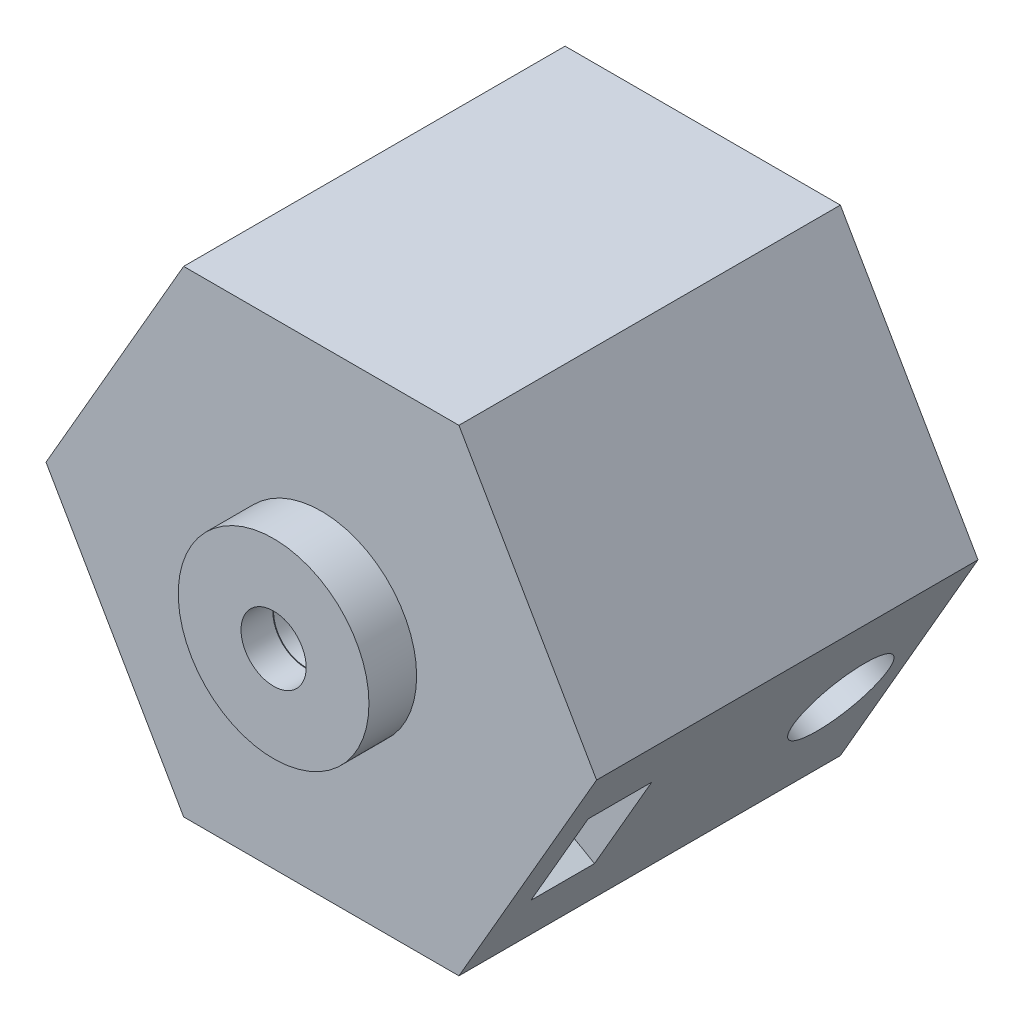
ISO-10303-21;
HEADER;
FILE_DESCRIPTION(('STEP AP214'),'2;1');
FILE_NAME('part.step','',(''),(''),'','','');
FILE_SCHEMA(('AUTOMOTIVE_DESIGN { 1 0 10303 214 1 1 1 1 }'));
ENDSEC;
DATA;
#1=APPLICATION_CONTEXT('core data for automotive mechanical design processes');
#2=APPLICATION_PROTOCOL_DEFINITION('international standard','automotive_design',2000,#1);
#3=PRODUCT_CONTEXT('',#1,'mechanical');
#4=PRODUCT('Part','Part','',(#3));
#5=PRODUCT_RELATED_PRODUCT_CATEGORY('part','',(#4));
#6=PRODUCT_DEFINITION_FORMATION('','',#4);
#7=PRODUCT_DEFINITION_CONTEXT('part definition',#1,'design');
#8=PRODUCT_DEFINITION('design','',#6,#7);
#9=PRODUCT_DEFINITION_SHAPE('','',#8);
#10=(LENGTH_UNIT() NAMED_UNIT(*) SI_UNIT(.MILLI.,.METRE.));
#11=(NAMED_UNIT(*) PLANE_ANGLE_UNIT() SI_UNIT($,.RADIAN.));
#12=(NAMED_UNIT(*) SI_UNIT($,.STERADIAN.) SOLID_ANGLE_UNIT());
#13=UNCERTAINTY_MEASURE_WITH_UNIT(LENGTH_MEASURE(1.E-05),#10,'distance_accuracy_value','');
#14=(GEOMETRIC_REPRESENTATION_CONTEXT(3) GLOBAL_UNCERTAINTY_ASSIGNED_CONTEXT((#13)) GLOBAL_UNIT_ASSIGNED_CONTEXT((#10,
#11,#12)) REPRESENTATION_CONTEXT('',''));
#15=CARTESIAN_POINT('',(0.,0.,0.));
#16=DIRECTION('',(0.,0.,1.));
#17=DIRECTION('',(1.,0.,0.));
#18=AXIS2_PLACEMENT_3D('',#15,#16,#17);
#19=CARTESIAN_POINT('',(8.66025403784438,-15.,11.));
#20=DIRECTION('',(-0.866025403784438,0.5,0.));
#21=DIRECTION('',(-0.5,-0.866025403784439,0.));
#22=AXIS2_PLACEMENT_3D('',#19,#20,#21);
#23=PLANE('',#22);
#24=DIRECTION('',(0.,0.,-1.));
#25=VECTOR('',#24,1.);
#26=CARTESIAN_POINT('',(14.7903810567666,-4.38230854637602,11.));
#27=LINE('',#26,#25);
#28=CARTESIAN_POINT('',(14.7903810567666,-4.38230854637602,22.));
#29=VERTEX_POINT('',#28);
#30=CARTESIAN_POINT('',(14.7903810567666,-4.38230854637602,18.));
#31=VERTEX_POINT('',#30);
#32=EDGE_CURVE('E409',#29,#31,#27,.T.);
#33=ORIENTED_EDGE('',*,*,#32,.T.);
#34=DIRECTION('',(-0.5,-0.866025403784439,0.));
#35=VECTOR('',#34,1.);
#36=CARTESIAN_POINT('',(8.66025403784438,-15.,18.));
#37=LINE('',#36,#35);
#38=CARTESIAN_POINT('',(11.1903810567666,-10.617691453624,18.));
#39=VERTEX_POINT('',#38);
#40=EDGE_CURVE('E412',#31,#39,#37,.T.);
#41=ORIENTED_EDGE('',*,*,#40,.T.);
#42=DIRECTION('',(0.,0.,1.));
#43=VECTOR('',#42,1.);
#44=CARTESIAN_POINT('',(11.1903810567666,-10.617691453624,11.));
#45=LINE('',#44,#43);
#46=CARTESIAN_POINT('',(11.1903810567666,-10.617691453624,22.));
#47=VERTEX_POINT('',#46);
#48=EDGE_CURVE('E389',#39,#47,#45,.T.);
#49=ORIENTED_EDGE('',*,*,#48,.T.);
#50=DIRECTION('',(0.5,0.866025403784439,0.));
#51=VECTOR('',#50,1.);
#52=CARTESIAN_POINT('',(8.66025403784438,-15.,22.));
#53=LINE('',#52,#51);
#54=EDGE_CURVE('E401',#47,#29,#53,.T.);
#55=ORIENTED_EDGE('',*,*,#54,.T.);
#56=EDGE_LOOP('',(#33,#41,#49,#55));
#57=FACE_BOUND('',#56,.T.);
#58=CARTESIAN_POINT('',(12.9903810567666,-7.5,4.3));
#59=DIRECTION('',(-0.866025403784438,0.5,0.));
#60=DIRECTION('',(-0.5,-0.866025403784439,0.));
#61=AXIS2_PLACEMENT_3D('',#58,#59,#60);
#62=CIRCLE('',#61,3.);
#63=CARTESIAN_POINT('',(11.4903810567666,-10.0980762113533,4.3));
#64=VERTEX_POINT('',#63);
#65=EDGE_CURVE('E367',#64,#64,#62,.T.);
#66=ORIENTED_EDGE('',*,*,#65,.T.);
#67=EDGE_LOOP('',(#66));
#68=FACE_BOUND('',#67,.T.);
#69=DIRECTION('',(0.499999999999993,0.866025403784443,0.));
#70=VECTOR('',#69,1.);
#71=CARTESIAN_POINT('',(8.66025403784448,-14.9999999999999,24.));
#72=LINE('',#71,#70);
#73=CARTESIAN_POINT('',(8.66025403784448,-14.9999999999999,24.));
#74=VERTEX_POINT('',#73);
#75=CARTESIAN_POINT('',(17.3205080756888,1.54390389361936E-13,24.));
#76=VERTEX_POINT('',#75);
#77=EDGE_CURVE('E350',#74,#76,#72,.T.);
#78=ORIENTED_EDGE('',*,*,#77,.F.);
#79=DIRECTION('',(0.,0.,-1.));
#80=VECTOR('',#79,1.);
#81=CARTESIAN_POINT('',(8.66025403784438,-15.,11.));
#82=LINE('',#81,#80);
#83=CARTESIAN_POINT('',(8.66025403784438,-15.,0.));
#84=VERTEX_POINT('',#83);
#85=EDGE_CURVE('E330',#74,#84,#82,.T.);
#86=ORIENTED_EDGE('',*,*,#85,.T.);
#87=DIRECTION('',(0.5,0.866025403784439,0.));
#88=VECTOR('',#87,1.);
#89=CARTESIAN_POINT('',(8.66025403784438,-15.,0.));
#90=LINE('',#89,#88);
#91=CARTESIAN_POINT('',(17.3205080756888,0.,0.));
#92=VERTEX_POINT('',#91);
#93=EDGE_CURVE('E309',#84,#92,#90,.T.);
#94=ORIENTED_EDGE('',*,*,#93,.T.);
#95=DIRECTION('',(0.,0.,-1.));
#96=VECTOR('',#95,1.);
#97=CARTESIAN_POINT('',(17.3205080756888,0.,11.));
#98=LINE('',#97,#96);
#99=EDGE_CURVE('E12',#76,#92,#98,.T.);
#100=ORIENTED_EDGE('',*,*,#99,.F.);
#101=EDGE_LOOP('',(#78,#86,#94,#100));
#102=FACE_BOUND('',#101,.T.);
#103=ADVANCED_FACE('F65',(#57,#68,#102),#23,.F.);
#104=CARTESIAN_POINT('',(17.3205080756888,0.,11.));
#105=DIRECTION('',(-0.866025403784439,-0.5,0.));
#106=DIRECTION('',(0.5,-0.866025403784439,0.));
#107=AXIS2_PLACEMENT_3D('',#104,#105,#106);
#108=PLANE('',#107);
#109=DIRECTION('',(-0.500000000000009,0.866025403784434,0.));
#110=VECTOR('',#109,1.);
#111=CARTESIAN_POINT('',(17.3205080756888,1.54390389361936E-13,24.));
#112=LINE('',#111,#110);
#113=CARTESIAN_POINT('',(8.66025403784422,15.0000000000001,24.));
#114=VERTEX_POINT('',#113);
#115=EDGE_CURVE('E182',#76,#114,#112,.T.);
#116=ORIENTED_EDGE('',*,*,#115,.F.);
#117=ORIENTED_EDGE('',*,*,#99,.T.);
#118=DIRECTION('',(-0.5,0.866025403784439,0.));
#119=VECTOR('',#118,1.);
#120=CARTESIAN_POINT('',(17.3205080756888,0.,0.));
#121=LINE('',#120,#119);
#122=CARTESIAN_POINT('',(8.66025403784438,15.,0.));
#123=VERTEX_POINT('',#122);
#124=EDGE_CURVE('E313',#92,#123,#121,.T.);
#125=ORIENTED_EDGE('',*,*,#124,.T.);
#126=DIRECTION('',(0.,0.,-1.));
#127=VECTOR('',#126,1.);
#128=CARTESIAN_POINT('',(8.66025403784438,15.,11.));
#129=LINE('',#128,#127);
#130=EDGE_CURVE('E74',#114,#123,#129,.T.);
#131=ORIENTED_EDGE('',*,*,#130,.F.);
#132=EDGE_LOOP('',(#116,#117,#125,#131));
#133=FACE_BOUND('',#132,.T.);
#134=ADVANCED_FACE('F438',(#133),#108,.F.);
#135=CARTESIAN_POINT('',(8.66025403784438,15.,11.));
#136=DIRECTION('',(0.,-1.,0.));
#137=DIRECTION('',(1.,0.,0.));
#138=AXIS2_PLACEMENT_3D('',#135,#136,#137);
#139=PLANE('',#138);
#140=DIRECTION('',(-1.,0.,0.));
#141=VECTOR('',#140,1.);
#142=CARTESIAN_POINT('',(8.66025403784422,15.0000000000001,24.));
#143=LINE('',#142,#141);
#144=CARTESIAN_POINT('',(-8.66025403784438,15.,24.));
#145=VERTEX_POINT('',#144);
#146=EDGE_CURVE('E177',#114,#145,#143,.T.);
#147=ORIENTED_EDGE('',*,*,#146,.F.);
#148=ORIENTED_EDGE('',*,*,#130,.T.);
#149=DIRECTION('',(-1.,0.,0.));
#150=VECTOR('',#149,1.);
#151=CARTESIAN_POINT('',(8.66025403784438,15.,0.));
#152=LINE('',#151,#150);
#153=CARTESIAN_POINT('',(-8.66025403784438,15.,0.));
#154=VERTEX_POINT('',#153);
#155=EDGE_CURVE('E200',#123,#154,#152,.T.);
#156=ORIENTED_EDGE('',*,*,#155,.T.);
#157=DIRECTION('',(0.,0.,-1.));
#158=VECTOR('',#157,1.);
#159=CARTESIAN_POINT('',(-8.66025403784438,15.,11.));
#160=LINE('',#159,#158);
#161=EDGE_CURVE('E193',#145,#154,#160,.T.);
#162=ORIENTED_EDGE('',*,*,#161,.F.);
#163=EDGE_LOOP('',(#147,#148,#156,#162));
#164=FACE_BOUND('',#163,.T.);
#165=ADVANCED_FACE('F198',(#164),#139,.F.);
#166=CARTESIAN_POINT('',(-8.66025403784438,15.,11.));
#167=DIRECTION('',(0.866025403784439,-0.5,0.));
#168=DIRECTION('',(0.5,0.866025403784439,0.));
#169=AXIS2_PLACEMENT_3D('',#166,#167,#168);
#170=PLANE('',#169);
#171=DIRECTION('',(0.,0.,1.));
#172=VECTOR('',#171,1.);
#173=CARTESIAN_POINT('',(-14.7903810567666,4.38230854637602,18.));
#174=LINE('',#173,#172);
#175=CARTESIAN_POINT('',(-14.7903810567666,4.38230854637602,18.));
#176=VERTEX_POINT('',#175);
#177=CARTESIAN_POINT('',(-14.7903810567666,4.38230854637602,22.));
#178=VERTEX_POINT('',#177);
#179=EDGE_CURVE('E374',#176,#178,#174,.T.);
#180=ORIENTED_EDGE('',*,*,#179,.F.);
#181=DIRECTION('',(-0.5,-0.866025403784439,0.));
#182=VECTOR('',#181,1.);
#183=CARTESIAN_POINT('',(-11.1903810567666,10.617691453624,18.));
#184=LINE('',#183,#182);
#185=CARTESIAN_POINT('',(-11.1903810567666,10.617691453624,18.));
#186=VERTEX_POINT('',#185);
#187=EDGE_CURVE('E371',#186,#176,#184,.T.);
#188=ORIENTED_EDGE('',*,*,#187,.F.);
#189=DIRECTION('',(0.,0.,-1.));
#190=VECTOR('',#189,1.);
#191=CARTESIAN_POINT('',(-11.1903810567666,10.617691453624,18.));
#192=LINE('',#191,#190);
#193=CARTESIAN_POINT('',(-11.1903810567666,10.617691453624,22.));
#194=VERTEX_POINT('',#193);
#195=EDGE_CURVE('E381',#194,#186,#192,.T.);
#196=ORIENTED_EDGE('',*,*,#195,.F.);
#197=DIRECTION('',(0.5,0.866025403784439,0.));
#198=VECTOR('',#197,1.);
#199=CARTESIAN_POINT('',(-11.1903810567666,10.617691453624,22.));
#200=LINE('',#199,#198);
#201=EDGE_CURVE('E377',#178,#194,#200,.T.);
#202=ORIENTED_EDGE('',*,*,#201,.F.);
#203=EDGE_LOOP('',(#180,#188,#196,#202));
#204=FACE_BOUND('',#203,.T.);
#205=CARTESIAN_POINT('',(-12.9903810567666,7.5,4.3));
#206=DIRECTION('',(-0.866025403784439,0.5,0.));
#207=DIRECTION('',(-0.5,-0.866025403784439,0.));
#208=AXIS2_PLACEMENT_3D('',#205,#206,#207);
#209=CIRCLE('',#208,3.);
#210=CARTESIAN_POINT('',(-14.4903810567666,4.90192378864669,4.3));
#211=VERTEX_POINT('',#210);
#212=EDGE_CURVE('E355',#211,#211,#209,.T.);
#213=ORIENTED_EDGE('',*,*,#212,.F.);
#214=EDGE_LOOP('',(#213));
#215=FACE_BOUND('',#214,.T.);
#216=DIRECTION('',(-0.499999999999999,-0.866025403784439,0.));
#217=VECTOR('',#216,1.);
#218=CARTESIAN_POINT('',(-8.66025403784438,15.,24.));
#219=LINE('',#218,#217);
#220=CARTESIAN_POINT('',(-17.3205080756888,0.,24.));
#221=VERTEX_POINT('',#220);
#222=EDGE_CURVE('E180',#145,#221,#219,.T.);
#223=ORIENTED_EDGE('',*,*,#222,.F.);
#224=ORIENTED_EDGE('',*,*,#161,.T.);
#225=DIRECTION('',(-0.5,-0.866025403784439,0.));
#226=VECTOR('',#225,1.);
#227=CARTESIAN_POINT('',(-8.66025403784438,15.,0.));
#228=LINE('',#227,#226);
#229=CARTESIAN_POINT('',(-17.3205080756888,0.,0.));
#230=VERTEX_POINT('',#229);
#231=EDGE_CURVE('E319',#154,#230,#228,.T.);
#232=ORIENTED_EDGE('',*,*,#231,.T.);
#233=DIRECTION('',(0.,0.,-1.));
#234=VECTOR('',#233,1.);
#235=CARTESIAN_POINT('',(-17.3205080756888,0.,11.));
#236=LINE('',#235,#234);
#237=EDGE_CURVE('E195',#221,#230,#236,.T.);
#238=ORIENTED_EDGE('',*,*,#237,.F.);
#239=EDGE_LOOP('',(#223,#224,#232,#238));
#240=FACE_BOUND('',#239,.T.);
#241=ADVANCED_FACE('F191',(#204,#215,#240),#170,.F.);
#242=CARTESIAN_POINT('',(-17.3205080756888,0.,11.));
#243=DIRECTION('',(0.866025403784439,0.5,0.));
#244=DIRECTION('',(-0.5,0.866025403784439,0.));
#245=AXIS2_PLACEMENT_3D('',#242,#243,#244);
#246=PLANE('',#245);
#247=DIRECTION('',(0.500000000000003,-0.866025403784437,0.));
#248=VECTOR('',#247,1.);
#249=CARTESIAN_POINT('',(-17.3205080756888,0.,24.));
#250=LINE('',#249,#248);
#251=CARTESIAN_POINT('',(-8.66025403784439,-15.,24.));
#252=VERTEX_POINT('',#251);
#253=EDGE_CURVE('E82',#221,#252,#250,.T.);
#254=ORIENTED_EDGE('',*,*,#253,.F.);
#255=ORIENTED_EDGE('',*,*,#237,.T.);
#256=DIRECTION('',(0.5,-0.866025403784439,0.));
#257=VECTOR('',#256,1.);
#258=CARTESIAN_POINT('',(-17.3205080756888,0.,0.));
#259=LINE('',#258,#257);
#260=CARTESIAN_POINT('',(-8.66025403784439,-15.,0.));
#261=VERTEX_POINT('',#260);
#262=EDGE_CURVE('E322',#230,#261,#259,.T.);
#263=ORIENTED_EDGE('',*,*,#262,.T.);
#264=DIRECTION('',(0.,0.,-1.));
#265=VECTOR('',#264,1.);
#266=CARTESIAN_POINT('',(-8.66025403784439,-15.,11.));
#267=LINE('',#266,#265);
#268=EDGE_CURVE('E207',#252,#261,#267,.T.);
#269=ORIENTED_EDGE('',*,*,#268,.F.);
#270=EDGE_LOOP('',(#254,#255,#263,#269));
#271=FACE_BOUND('',#270,.T.);
#272=ADVANCED_FACE('F342',(#271),#246,.F.);
#273=CARTESIAN_POINT('',(-8.66025403784439,-15.,11.));
#274=DIRECTION('',(0.,1.,0.));
#275=DIRECTION('',(-1.,0.,0.));
#276=AXIS2_PLACEMENT_3D('',#273,#274,#275);
#277=PLANE('',#276);
#278=DIRECTION('',(1.,0.,0.));
#279=VECTOR('',#278,1.);
#280=CARTESIAN_POINT('',(-8.66025403784433,-15.,24.));
#281=LINE('',#280,#279);
#282=EDGE_CURVE('E339',#252,#74,#281,.T.);
#283=ORIENTED_EDGE('',*,*,#282,.F.);
#284=ORIENTED_EDGE('',*,*,#268,.T.);
#285=DIRECTION('',(1.,0.,0.));
#286=VECTOR('',#285,1.);
#287=CARTESIAN_POINT('',(-8.66025403784439,-15.,0.));
#288=LINE('',#287,#286);
#289=EDGE_CURVE('E326',#261,#84,#288,.T.);
#290=ORIENTED_EDGE('',*,*,#289,.T.);
#291=ORIENTED_EDGE('',*,*,#85,.F.);
#292=EDGE_LOOP('',(#283,#284,#290,#291));
#293=FACE_BOUND('',#292,.T.);
#294=ADVANCED_FACE('F335',(#293),#277,.F.);
#295=CARTESIAN_POINT('',(0.,0.,27.));
#296=DIRECTION('',(0.,0.,1.));
#297=DIRECTION('',(1.,0.,0.));
#298=AXIS2_PLACEMENT_3D('',#295,#296,#297);
#299=PLANE('',#298);
#300=CARTESIAN_POINT('',(0.,0.,27.));
#301=DIRECTION('',(0.,0.,1.));
#302=DIRECTION('',(1.,0.,0.));
#303=AXIS2_PLACEMENT_3D('',#300,#301,#302);
#304=CIRCLE('',#303,2.05);
#305=CARTESIAN_POINT('',(2.05,0.,27.));
#306=VERTEX_POINT('',#305);
#307=EDGE_CURVE('E219',#306,#306,#304,.T.);
#308=ORIENTED_EDGE('',*,*,#307,.F.);
#309=EDGE_LOOP('',(#308));
#310=FACE_BOUND('',#309,.T.);
#311=CARTESIAN_POINT('',(0.,0.,27.));
#312=DIRECTION('',(0.,0.,1.));
#313=DIRECTION('',(1.,0.,0.));
#314=AXIS2_PLACEMENT_3D('',#311,#312,#313);
#315=CIRCLE('',#314,6.);
#316=CARTESIAN_POINT('',(6.,0.,27.));
#317=VERTEX_POINT('',#316);
#318=EDGE_CURVE('E501',#317,#317,#315,.T.);
#319=ORIENTED_EDGE('',*,*,#318,.T.);
#320=EDGE_LOOP('',(#319));
#321=FACE_BOUND('',#320,.T.);
#322=ADVANCED_FACE('F426',(#310,#321),#299,.T.);
#323=CARTESIAN_POINT('',(0.,0.,27.));
#324=DIRECTION('',(0.,0.,-1.));
#325=DIRECTION('',(-1.,0.,0.));
#326=AXIS2_PLACEMENT_3D('',#323,#324,#325);
#327=CYLINDRICAL_SURFACE('',#326,2.);
#328=CARTESIAN_POINT('',(0.,0.,18.));
#329=DIRECTION('',(0.,0.,-1.));
#330=DIRECTION('',(-1.,0.,0.));
#331=AXIS2_PLACEMENT_3D('',#328,#329,#330);
#332=CIRCLE('',#331,2.);
#333=CARTESIAN_POINT('',(-2.,0.,18.));
#334=VERTEX_POINT('',#333);
#335=EDGE_CURVE('E234',#334,#334,#332,.T.);
#336=ORIENTED_EDGE('',*,*,#335,.F.);
#337=EDGE_LOOP('',(#336));
#338=FACE_BOUND('',#337,.T.);
#339=CARTESIAN_POINT('',(0.,0.,15.));
#340=DIRECTION('',(0.,0.,-1.));
#341=DIRECTION('',(-1.,0.,0.));
#342=AXIS2_PLACEMENT_3D('',#339,#340,#341);
#343=CIRCLE('',#342,2.);
#344=CARTESIAN_POINT('',(-2.,0.,15.));
#345=VERTEX_POINT('',#344);
#346=EDGE_CURVE('E216',#345,#345,#343,.T.);
#347=ORIENTED_EDGE('',*,*,#346,.T.);
#348=EDGE_LOOP('',(#347));
#349=FACE_BOUND('',#348,.T.);
#350=ADVANCED_FACE('F423',(#338,#349),#327,.F.);
#351=CARTESIAN_POINT('',(0.,0.,22.));
#352=DIRECTION('',(0.,0.,1.));
#353=DIRECTION('',(1.,0.,0.));
#354=AXIS2_PLACEMENT_3D('',#351,#352,#353);
#355=CIRCLE('',#354,2.);
#356=CARTESIAN_POINT('',(2.,0.,22.));
#357=VERTEX_POINT('',#356);
#358=EDGE_CURVE('E405',#357,#357,#355,.T.);
#359=ORIENTED_EDGE('',*,*,#358,.F.);
#360=EDGE_LOOP('',(#359));
#361=FACE_BOUND('',#360,.T.);
#362=CARTESIAN_POINT('',(0.,0.,25.));
#363=DIRECTION('',(0.,0.,1.));
#364=DIRECTION('',(1.,0.,0.));
#365=AXIS2_PLACEMENT_3D('',#362,#363,#364);
#366=CIRCLE('',#365,2.);
#367=CARTESIAN_POINT('',(2.,0.,25.));
#368=VERTEX_POINT('',#367);
#369=EDGE_CURVE('E211',#368,#368,#366,.T.);
#370=ORIENTED_EDGE('',*,*,#369,.T.);
#371=EDGE_LOOP('',(#370));
#372=FACE_BOUND('',#371,.T.);
#373=ADVANCED_FACE('F425',(#361,#372),#327,.F.);
#374=CARTESIAN_POINT('',(0.,0.,0.));
#375=DIRECTION('',(0.,0.,1.));
#376=DIRECTION('',(1.,0.,0.));
#377=AXIS2_PLACEMENT_3D('',#374,#375,#376);
#378=PLANE('',#377);
#379=ORIENTED_EDGE('',*,*,#93,.F.);
#380=ORIENTED_EDGE('',*,*,#289,.F.);
#381=ORIENTED_EDGE('',*,*,#262,.F.);
#382=ORIENTED_EDGE('',*,*,#231,.F.);
#383=ORIENTED_EDGE('',*,*,#155,.F.);
#384=ORIENTED_EDGE('',*,*,#124,.F.);
#385=EDGE_LOOP('',(#379,#380,#381,#382,#383,#384));
#386=FACE_BOUND('',#385,.T.);
#387=DIRECTION('',(0.499999999999995,0.866025403784441,0.));
#388=VECTOR('',#387,1.);
#389=CARTESIAN_POINT('',(6.35085296108601,-10.9999999999999,0.));
#390=LINE('',#389,#388);
#391=CARTESIAN_POINT('',(6.35085296108601,-10.9999999999999,0.));
#392=VERTEX_POINT('',#391);
#393=CARTESIAN_POINT('',(12.7017059221718,0.,0.));
#394=VERTEX_POINT('',#393);
#395=EDGE_CURVE('E214',#392,#394,#390,.T.);
#396=ORIENTED_EDGE('',*,*,#395,.T.);
#397=DIRECTION('',(-0.500000000000001,0.866025403784438,0.));
#398=VECTOR('',#397,1.);
#399=CARTESIAN_POINT('',(12.7017059221718,0.,0.));
#400=LINE('',#399,#398);
#401=CARTESIAN_POINT('',(6.35085296108586,11.,0.));
#402=VERTEX_POINT('',#401);
#403=EDGE_CURVE('E271',#394,#402,#400,.T.);
#404=ORIENTED_EDGE('',*,*,#403,.T.);
#405=DIRECTION('',(-1.,0.,0.));
#406=VECTOR('',#405,1.);
#407=CARTESIAN_POINT('',(6.35085296108586,11.,0.));
#408=LINE('',#407,#406);
#409=CARTESIAN_POINT('',(-6.35085296108594,11.,0.));
#410=VERTEX_POINT('',#409);
#411=EDGE_CURVE('E275',#402,#410,#408,.T.);
#412=ORIENTED_EDGE('',*,*,#411,.T.);
#413=DIRECTION('',(-0.499999999999995,-0.866025403784442,0.));
#414=VECTOR('',#413,1.);
#415=CARTESIAN_POINT('',(-6.35085296108594,11.,0.));
#416=LINE('',#415,#414);
#417=CARTESIAN_POINT('',(-12.7017059221718,0.,0.));
#418=VERTEX_POINT('',#417);
#419=EDGE_CURVE('E279',#410,#418,#416,.T.);
#420=ORIENTED_EDGE('',*,*,#419,.T.);
#421=DIRECTION('',(0.500000000000007,-0.866025403784435,0.));
#422=VECTOR('',#421,1.);
#423=CARTESIAN_POINT('',(-12.7017059221718,0.,0.));
#424=LINE('',#423,#422);
#425=CARTESIAN_POINT('',(-6.35085296108578,-11.0000000000001,0.));
#426=VERTEX_POINT('',#425);
#427=EDGE_CURVE('E283',#418,#426,#424,.T.);
#428=ORIENTED_EDGE('',*,*,#427,.T.);
#429=DIRECTION('',(1.,0.,0.));
#430=VECTOR('',#429,1.);
#431=CARTESIAN_POINT('',(-6.35085296108578,-11.0000000000001,0.));
#432=LINE('',#431,#430);
#433=EDGE_CURVE('E247',#426,#392,#432,.T.);
#434=ORIENTED_EDGE('',*,*,#433,.T.);
#435=EDGE_LOOP('',(#396,#404,#412,#420,#428,#434));
#436=FACE_BOUND('',#435,.T.);
#437=ADVANCED_FACE('F344',(#386,#436),#378,.F.);
#438=CARTESIAN_POINT('',(6.35085296108601,-10.9999999999999,11.));
#439=DIRECTION('',(-0.866025403784441,0.499999999999995,0.));
#440=DIRECTION('',(-0.499999999999995,-0.866025403784441,0.));
#441=AXIS2_PLACEMENT_3D('',#438,#439,#440);
#442=PLANE('',#441);
#443=CARTESIAN_POINT('',(9.52627944162886,-5.50000000000002,4.3));
#444=DIRECTION('',(-0.866025403784441,0.499999999999995,0.));
#445=DIRECTION('',(-0.499999999999995,-0.866025403784441,0.));
#446=AXIS2_PLACEMENT_3D('',#443,#444,#445);
#447=CIRCLE('',#446,3.);
#448=CARTESIAN_POINT('',(8.02627944162888,-8.09807621135335,4.3));
#449=VERTEX_POINT('',#448);
#450=EDGE_CURVE('E363',#449,#449,#447,.T.);
#451=ORIENTED_EDGE('',*,*,#450,.F.);
#452=EDGE_LOOP('',(#451));
#453=FACE_BOUND('',#452,.T.);
#454=ORIENTED_EDGE('',*,*,#395,.F.);
#455=DIRECTION('',(0.,0.,-1.));
#456=VECTOR('',#455,1.);
#457=CARTESIAN_POINT('',(6.35085296108601,-10.9999999999999,11.));
#458=LINE('',#457,#456);
#459=CARTESIAN_POINT('',(6.35085296108601,-10.9999999999999,11.));
#460=VERTEX_POINT('',#459);
#461=EDGE_CURVE('E267',#460,#392,#458,.T.);
#462=ORIENTED_EDGE('',*,*,#461,.F.);
#463=DIRECTION('',(0.499999999999995,0.866025403784441,0.));
#464=VECTOR('',#463,1.);
#465=CARTESIAN_POINT('',(6.35085296108601,-10.9999999999999,11.));
#466=LINE('',#465,#464);
#467=CARTESIAN_POINT('',(12.7017059221718,0.,11.));
#468=VERTEX_POINT('',#467);
#469=EDGE_CURVE('E242',#460,#468,#466,.T.);
#470=ORIENTED_EDGE('',*,*,#469,.T.);
#471=DIRECTION('',(0.,0.,-1.));
#472=VECTOR('',#471,1.);
#473=CARTESIAN_POINT('',(12.7017059221718,0.,11.));
#474=LINE('',#473,#472);
#475=EDGE_CURVE('E305',#468,#394,#474,.T.);
#476=ORIENTED_EDGE('',*,*,#475,.T.);
#477=EDGE_LOOP('',(#454,#462,#470,#476));
#478=FACE_BOUND('',#477,.T.);
#479=ADVANCED_FACE('F709',(#453,#478),#442,.T.);
#480=CARTESIAN_POINT('',(12.7017059221718,0.,11.));
#481=DIRECTION('',(-0.866025403784438,-0.500000000000001,0.));
#482=DIRECTION('',(0.500000000000001,-0.866025403784438,0.));
#483=AXIS2_PLACEMENT_3D('',#480,#481,#482);
#484=PLANE('',#483);
#485=ORIENTED_EDGE('',*,*,#403,.F.);
#486=ORIENTED_EDGE('',*,*,#475,.F.);
#487=DIRECTION('',(-0.500000000000001,0.866025403784438,0.));
#488=VECTOR('',#487,1.);
#489=CARTESIAN_POINT('',(12.7017059221718,0.,11.));
#490=LINE('',#489,#488);
#491=CARTESIAN_POINT('',(6.35085296108586,11.,11.));
#492=VERTEX_POINT('',#491);
#493=EDGE_CURVE('E246',#468,#492,#490,.T.);
#494=ORIENTED_EDGE('',*,*,#493,.T.);
#495=DIRECTION('',(0.,0.,-1.));
#496=VECTOR('',#495,1.);
#497=CARTESIAN_POINT('',(6.35085296108586,11.,11.));
#498=LINE('',#497,#496);
#499=EDGE_CURVE('E302',#492,#402,#498,.T.);
#500=ORIENTED_EDGE('',*,*,#499,.T.);
#501=EDGE_LOOP('',(#485,#486,#494,#500));
#502=FACE_BOUND('',#501,.T.);
#503=ADVANCED_FACE('F699',(#502),#484,.T.);
#504=CARTESIAN_POINT('',(6.35085296108586,11.,11.));
#505=DIRECTION('',(0.,-1.,0.));
#506=DIRECTION('',(1.,0.,0.));
#507=AXIS2_PLACEMENT_3D('',#504,#505,#506);
#508=PLANE('',#507);
#509=ORIENTED_EDGE('',*,*,#411,.F.);
#510=ORIENTED_EDGE('',*,*,#499,.F.);
#511=DIRECTION('',(-1.,0.,0.));
#512=VECTOR('',#511,1.);
#513=CARTESIAN_POINT('',(6.35085296108586,11.,11.));
#514=LINE('',#513,#512);
#515=CARTESIAN_POINT('',(-6.35085296108594,11.,11.));
#516=VERTEX_POINT('',#515);
#517=EDGE_CURVE('E251',#492,#516,#514,.T.);
#518=ORIENTED_EDGE('',*,*,#517,.T.);
#519=DIRECTION('',(0.,0.,-1.));
#520=VECTOR('',#519,1.);
#521=CARTESIAN_POINT('',(-6.35085296108594,11.,11.));
#522=LINE('',#521,#520);
#523=EDGE_CURVE('E299',#516,#410,#522,.T.);
#524=ORIENTED_EDGE('',*,*,#523,.T.);
#525=EDGE_LOOP('',(#509,#510,#518,#524));
#526=FACE_BOUND('',#525,.T.);
#527=ADVANCED_FACE('F690',(#526),#508,.T.);
#528=CARTESIAN_POINT('',(-6.35085296108594,11.,11.));
#529=DIRECTION('',(0.866025403784442,-0.499999999999995,0.));
#530=DIRECTION('',(0.499999999999995,0.866025403784442,0.));
#531=AXIS2_PLACEMENT_3D('',#528,#529,#530);
#532=PLANE('',#531);
#533=CARTESIAN_POINT('',(-9.52627944162883,5.5,4.3));
#534=DIRECTION('',(0.866025403784442,-0.499999999999995,0.));
#535=DIRECTION('',(0.499999999999995,0.866025403784442,0.));
#536=AXIS2_PLACEMENT_3D('',#533,#534,#535);
#537=CIRCLE('',#536,3.);
#538=CARTESIAN_POINT('',(-8.02627944162884,8.09807621135332,4.3));
#539=VERTEX_POINT('',#538);
#540=EDGE_CURVE('E68',#539,#539,#537,.T.);
#541=ORIENTED_EDGE('',*,*,#540,.F.);
#542=EDGE_LOOP('',(#541));
#543=FACE_BOUND('',#542,.T.);
#544=ORIENTED_EDGE('',*,*,#419,.F.);
#545=ORIENTED_EDGE('',*,*,#523,.F.);
#546=DIRECTION('',(-0.499999999999995,-0.866025403784442,0.));
#547=VECTOR('',#546,1.);
#548=CARTESIAN_POINT('',(-6.35085296108594,11.,11.));
#549=LINE('',#548,#547);
#550=CARTESIAN_POINT('',(-12.7017059221718,0.,11.));
#551=VERTEX_POINT('',#550);
#552=EDGE_CURVE('E255',#516,#551,#549,.T.);
#553=ORIENTED_EDGE('',*,*,#552,.T.);
#554=DIRECTION('',(0.,0.,-1.));
#555=VECTOR('',#554,1.);
#556=CARTESIAN_POINT('',(-12.7017059221718,0.,11.));
#557=LINE('',#556,#555);
#558=EDGE_CURVE('E296',#551,#418,#557,.T.);
#559=ORIENTED_EDGE('',*,*,#558,.T.);
#560=EDGE_LOOP('',(#544,#545,#553,#559));
#561=FACE_BOUND('',#560,.T.);
#562=ADVANCED_FACE('F680',(#543,#561),#532,.T.);
#563=CARTESIAN_POINT('',(-12.7017059221718,0.,11.));
#564=DIRECTION('',(0.866025403784435,0.500000000000007,0.));
#565=DIRECTION('',(-0.500000000000007,0.866025403784434,0.));
#566=AXIS2_PLACEMENT_3D('',#563,#564,#565);
#567=PLANE('',#566);
#568=ORIENTED_EDGE('',*,*,#427,.F.);
#569=ORIENTED_EDGE('',*,*,#558,.F.);
#570=DIRECTION('',(0.500000000000007,-0.866025403784435,0.));
#571=VECTOR('',#570,1.);
#572=CARTESIAN_POINT('',(-12.7017059221718,0.,11.));
#573=LINE('',#572,#571);
#574=CARTESIAN_POINT('',(-6.35085296108578,-11.0000000000001,11.));
#575=VERTEX_POINT('',#574);
#576=EDGE_CURVE('E259',#551,#575,#573,.T.);
#577=ORIENTED_EDGE('',*,*,#576,.T.);
#578=DIRECTION('',(0.,0.,-1.));
#579=VECTOR('',#578,1.);
#580=CARTESIAN_POINT('',(-6.35085296108578,-11.0000000000001,11.));
#581=LINE('',#580,#579);
#582=EDGE_CURVE('E293',#575,#426,#581,.T.);
#583=ORIENTED_EDGE('',*,*,#582,.T.);
#584=EDGE_LOOP('',(#568,#569,#577,#583));
#585=FACE_BOUND('',#584,.T.);
#586=ADVANCED_FACE('F670',(#585),#567,.T.);
#587=CARTESIAN_POINT('',(-6.35085296108578,-11.0000000000001,11.));
#588=DIRECTION('',(0.,1.,0.));
#589=DIRECTION('',(-1.,0.,0.));
#590=AXIS2_PLACEMENT_3D('',#587,#588,#589);
#591=PLANE('',#590);
#592=ORIENTED_EDGE('',*,*,#433,.F.);
#593=ORIENTED_EDGE('',*,*,#582,.F.);
#594=DIRECTION('',(1.,0.,0.));
#595=VECTOR('',#594,1.);
#596=CARTESIAN_POINT('',(-6.35085296108578,-11.0000000000001,11.));
#597=LINE('',#596,#595);
#598=EDGE_CURVE('E263',#575,#460,#597,.T.);
#599=ORIENTED_EDGE('',*,*,#598,.T.);
#600=ORIENTED_EDGE('',*,*,#461,.T.);
#601=EDGE_LOOP('',(#592,#593,#599,#600));
#602=FACE_BOUND('',#601,.T.);
#603=ADVANCED_FACE('F492',(#602),#591,.T.);
#604=CARTESIAN_POINT('',(0.,0.,11.));
#605=DIRECTION('',(0.,0.,1.));
#606=DIRECTION('',(1.,0.,0.));
#607=AXIS2_PLACEMENT_3D('',#604,#605,#606);
#608=PLANE('',#607);
#609=CARTESIAN_POINT('',(0.,0.,11.));
#610=DIRECTION('',(0.,0.,-1.));
#611=DIRECTION('',(-1.,0.,0.));
#612=AXIS2_PLACEMENT_3D('',#609,#610,#611);
#613=CIRCLE('',#612,3.5);
#614=CARTESIAN_POINT('',(-3.5,0.,11.));
#615=VERTEX_POINT('',#614);
#616=EDGE_CURVE('E228',#615,#615,#613,.T.);
#617=ORIENTED_EDGE('',*,*,#616,.F.);
#618=EDGE_LOOP('',(#617));
#619=FACE_BOUND('',#618,.T.);
#620=ORIENTED_EDGE('',*,*,#493,.F.);
#621=ORIENTED_EDGE('',*,*,#469,.F.);
#622=ORIENTED_EDGE('',*,*,#598,.F.);
#623=ORIENTED_EDGE('',*,*,#576,.F.);
#624=ORIENTED_EDGE('',*,*,#552,.F.);
#625=ORIENTED_EDGE('',*,*,#517,.F.);
#626=EDGE_LOOP('',(#620,#621,#622,#623,#624,#625));
#627=FACE_BOUND('',#626,.T.);
#628=ADVANCED_FACE('F486',(#619,#627),#608,.F.);
#629=CARTESIAN_POINT('',(0.,0.,25.));
#630=DIRECTION('',(0.,0.,1.));
#631=DIRECTION('',(1.,0.,0.));
#632=AXIS2_PLACEMENT_3D('',#629,#630,#631);
#633=CYLINDRICAL_SURFACE('',#632,2.05);
#634=CARTESIAN_POINT('',(0.,0.,25.));
#635=DIRECTION('',(0.,0.,1.));
#636=DIRECTION('',(1.,0.,0.));
#637=AXIS2_PLACEMENT_3D('',#634,#635,#636);
#638=CIRCLE('',#637,2.05);
#639=CARTESIAN_POINT('',(2.05,0.,25.));
#640=VERTEX_POINT('',#639);
#641=EDGE_CURVE('E215',#640,#640,#638,.T.);
#642=ORIENTED_EDGE('',*,*,#641,.F.);
#643=EDGE_LOOP('',(#642));
#644=FACE_BOUND('',#643,.T.);
#645=ORIENTED_EDGE('',*,*,#307,.T.);
#646=EDGE_LOOP('',(#645));
#647=FACE_BOUND('',#646,.T.);
#648=ADVANCED_FACE('F483',(#644,#647),#633,.F.);
#649=CARTESIAN_POINT('',(0.,0.,25.));
#650=DIRECTION('',(0.,0.,1.));
#651=DIRECTION('',(1.,0.,0.));
#652=AXIS2_PLACEMENT_3D('',#649,#650,#651);
#653=PLANE('',#652);
#654=ORIENTED_EDGE('',*,*,#369,.F.);
#655=EDGE_LOOP('',(#654));
#656=FACE_BOUND('',#655,.T.);
#657=ORIENTED_EDGE('',*,*,#641,.T.);
#658=EDGE_LOOP('',(#657));
#659=FACE_BOUND('',#658,.T.);
#660=ADVANCED_FACE('F480',(#656,#659),#653,.T.);
#661=CARTESIAN_POINT('',(0.,0.,15.));
#662=DIRECTION('',(0.,0.,-1.));
#663=DIRECTION('',(-1.,0.,0.));
#664=AXIS2_PLACEMENT_3D('',#661,#662,#663);
#665=CYLINDRICAL_SURFACE('',#664,3.5);
#666=CARTESIAN_POINT('',(0.,0.,15.));
#667=DIRECTION('',(0.,0.,-1.));
#668=DIRECTION('',(-1.,0.,0.));
#669=AXIS2_PLACEMENT_3D('',#666,#667,#668);
#670=CIRCLE('',#669,3.5);
#671=CARTESIAN_POINT('',(-3.5,0.,15.));
#672=VERTEX_POINT('',#671);
#673=EDGE_CURVE('E220',#672,#672,#670,.T.);
#674=ORIENTED_EDGE('',*,*,#673,.F.);
#675=EDGE_LOOP('',(#674));
#676=FACE_BOUND('',#675,.T.);
#677=ORIENTED_EDGE('',*,*,#616,.T.);
#678=EDGE_LOOP('',(#677));
#679=FACE_BOUND('',#678,.T.);
#680=ADVANCED_FACE('F476',(#676,#679),#665,.F.);
#681=CARTESIAN_POINT('',(0.,0.,15.));
#682=DIRECTION('',(0.,0.,-1.));
#683=DIRECTION('',(-1.,0.,0.));
#684=AXIS2_PLACEMENT_3D('',#681,#682,#683);
#685=PLANE('',#684);
#686=ORIENTED_EDGE('',*,*,#346,.F.);
#687=EDGE_LOOP('',(#686));
#688=FACE_BOUND('',#687,.T.);
#689=ORIENTED_EDGE('',*,*,#673,.T.);
#690=EDGE_LOOP('',(#689));
#691=FACE_BOUND('',#690,.T.);
#692=ADVANCED_FACE('F474',(#688,#691),#685,.T.);
#693=CARTESIAN_POINT('',(21.2855715851499,-8.13230854637603,18.));
#694=DIRECTION('',(0.,0.,-1.));
#695=DIRECTION('',(-1.,0.,0.));
#696=AXIS2_PLACEMENT_3D('',#693,#694,#695);
#697=PLANE('',#696);
#698=ORIENTED_EDGE('',*,*,#335,.T.);
#699=EDGE_LOOP('',(#698));
#700=FACE_BOUND('',#699,.T.);
#701=DIRECTION('',(-0.866025403784439,0.5,0.));
#702=VECTOR('',#701,1.);
#703=CARTESIAN_POINT('',(21.2855715851499,-8.13230854637603,18.));
#704=LINE('',#703,#702);
#705=EDGE_CURVE('E386',#31,#186,#704,.T.);
#706=ORIENTED_EDGE('',*,*,#705,.T.);
#707=ORIENTED_EDGE('',*,*,#187,.T.);
#708=DIRECTION('',(-0.866025403784439,0.5,0.));
#709=VECTOR('',#708,1.);
#710=CARTESIAN_POINT('',(17.6855715851499,-14.367691453624,18.));
#711=LINE('',#710,#709);
#712=EDGE_CURVE('E385',#39,#176,#711,.T.);
#713=ORIENTED_EDGE('',*,*,#712,.F.);
#714=ORIENTED_EDGE('',*,*,#40,.F.);
#715=EDGE_LOOP('',(#706,#707,#713,#714));
#716=FACE_BOUND('',#715,.T.);
#717=ADVANCED_FACE('F420',(#700,#716),#697,.F.);
#718=CARTESIAN_POINT('',(21.2855715851499,-8.13230854637603,18.));
#719=DIRECTION('',(0.5,0.866025403784439,0.));
#720=DIRECTION('',(-0.866025403784439,0.5,0.));
#721=AXIS2_PLACEMENT_3D('',#718,#719,#720);
#722=PLANE('',#721);
#723=DIRECTION('',(-0.866025403784439,0.5,0.));
#724=VECTOR('',#723,1.);
#725=CARTESIAN_POINT('',(21.2855715851499,-8.13230854637603,22.));
#726=LINE('',#725,#724);
#727=EDGE_CURVE('E390',#29,#194,#726,.T.);
#728=ORIENTED_EDGE('',*,*,#727,.T.);
#729=ORIENTED_EDGE('',*,*,#195,.T.);
#730=ORIENTED_EDGE('',*,*,#705,.F.);
#731=ORIENTED_EDGE('',*,*,#32,.F.);
#732=EDGE_LOOP('',(#728,#729,#730,#731));
#733=FACE_BOUND('',#732,.T.);
#734=ADVANCED_FACE('F462',(#733),#722,.F.);
#735=CARTESIAN_POINT('',(21.2855715851499,-8.13230854637603,22.));
#736=DIRECTION('',(0.,0.,1.));
#737=DIRECTION('',(1.,0.,0.));
#738=AXIS2_PLACEMENT_3D('',#735,#736,#737);
#739=PLANE('',#738);
#740=ORIENTED_EDGE('',*,*,#358,.T.);
#741=EDGE_LOOP('',(#740));
#742=FACE_BOUND('',#741,.T.);
#743=DIRECTION('',(-0.866025403784439,0.5,0.));
#744=VECTOR('',#743,1.);
#745=CARTESIAN_POINT('',(17.6855715851499,-14.367691453624,22.));
#746=LINE('',#745,#744);
#747=EDGE_CURVE('E90',#47,#178,#746,.T.);
#748=ORIENTED_EDGE('',*,*,#747,.T.);
#749=ORIENTED_EDGE('',*,*,#201,.T.);
#750=ORIENTED_EDGE('',*,*,#727,.F.);
#751=ORIENTED_EDGE('',*,*,#54,.F.);
#752=EDGE_LOOP('',(#748,#749,#750,#751));
#753=FACE_BOUND('',#752,.T.);
#754=ADVANCED_FACE('F465',(#742,#753),#739,.F.);
#755=CARTESIAN_POINT('',(17.6855715851499,-14.367691453624,18.));
#756=DIRECTION('',(-0.5,-0.866025403784439,0.));
#757=DIRECTION('',(0.866025403784439,-0.5,0.));
#758=AXIS2_PLACEMENT_3D('',#755,#756,#757);
#759=PLANE('',#758);
#760=ORIENTED_EDGE('',*,*,#712,.T.);
#761=ORIENTED_EDGE('',*,*,#179,.T.);
#762=ORIENTED_EDGE('',*,*,#747,.F.);
#763=ORIENTED_EDGE('',*,*,#48,.F.);
#764=EDGE_LOOP('',(#760,#761,#762,#763));
#765=FACE_BOUND('',#764,.T.);
#766=ADVANCED_FACE('F458',(#765),#759,.F.);
#767=CARTESIAN_POINT('',(19.4855715851499,-11.25,4.3));
#768=DIRECTION('',(-0.866025403784439,0.5,0.));
#769=DIRECTION('',(-0.5,-0.866025403784439,0.));
#770=AXIS2_PLACEMENT_3D('',#767,#768,#769);
#771=CYLINDRICAL_SURFACE('',#770,3.);
#772=ORIENTED_EDGE('',*,*,#540,.T.);
#773=EDGE_LOOP('',(#772));
#774=FACE_BOUND('',#773,.T.);
#775=ORIENTED_EDGE('',*,*,#212,.T.);
#776=EDGE_LOOP('',(#775));
#777=FACE_BOUND('',#776,.T.);
#778=ADVANCED_FACE('F448',(#774,#777),#771,.F.);
#779=ORIENTED_EDGE('',*,*,#450,.T.);
#780=EDGE_LOOP('',(#779));
#781=FACE_BOUND('',#780,.T.);
#782=ORIENTED_EDGE('',*,*,#65,.F.);
#783=EDGE_LOOP('',(#782));
#784=FACE_BOUND('',#783,.T.);
#785=ADVANCED_FACE('F447',(#781,#784),#771,.F.);
#786=CARTESIAN_POINT('',(0.,0.,24.));
#787=DIRECTION('',(0.,0.,1.));
#788=DIRECTION('',(1.,0.,0.));
#789=AXIS2_PLACEMENT_3D('',#786,#787,#788);
#790=PLANE('',#789);
#791=CARTESIAN_POINT('',(0.,0.,24.));
#792=DIRECTION('',(0.,0.,1.));
#793=DIRECTION('',(1.,0.,0.));
#794=AXIS2_PLACEMENT_3D('',#791,#792,#793);
#795=CIRCLE('',#794,6.);
#796=CARTESIAN_POINT('',(6.,0.,24.));
#797=VERTEX_POINT('',#796);
#798=EDGE_CURVE('E187',#797,#797,#795,.T.);
#799=ORIENTED_EDGE('',*,*,#798,.F.);
#800=EDGE_LOOP('',(#799));
#801=FACE_BOUND('',#800,.T.);
#802=ORIENTED_EDGE('',*,*,#146,.T.);
#803=ORIENTED_EDGE('',*,*,#222,.T.);
#804=ORIENTED_EDGE('',*,*,#253,.T.);
#805=ORIENTED_EDGE('',*,*,#282,.T.);
#806=ORIENTED_EDGE('',*,*,#77,.T.);
#807=ORIENTED_EDGE('',*,*,#115,.T.);
#808=EDGE_LOOP('',(#802,#803,#804,#805,#806,#807));
#809=FACE_BOUND('',#808,.T.);
#810=ADVANCED_FACE('F179',(#801,#809),#790,.T.);
#811=CARTESIAN_POINT('',(0.,0.,24.));
#812=DIRECTION('',(0.,0.,1.));
#813=DIRECTION('',(1.,0.,0.));
#814=AXIS2_PLACEMENT_3D('',#811,#812,#813);
#815=CYLINDRICAL_SURFACE('',#814,6.);
#816=ORIENTED_EDGE('',*,*,#798,.T.);
#817=EDGE_LOOP('',(#816));
#818=FACE_BOUND('',#817,.T.);
#819=ORIENTED_EDGE('',*,*,#318,.F.);
#820=EDGE_LOOP('',(#819));
#821=FACE_BOUND('',#820,.T.);
#822=ADVANCED_FACE('F455',(#818,#821),#815,.T.);
#823=CLOSED_SHELL('',(#103,#134,#165,#241,#272,#294,#322,#350,#373,#437,#479,#503,#527,#562,
#586,#603,#628,#648,#660,#680,#692,#717,#734,#754,#766,#778,#785,#810,#822));
#824=MANIFOLD_SOLID_BREP('B2',#823);
#825=ADVANCED_BREP_SHAPE_REPRESENTATION('',(#18,#824),#14);
#826=SHAPE_DEFINITION_REPRESENTATION(#9,#825);
ENDSEC;
END-ISO-10303-21;
